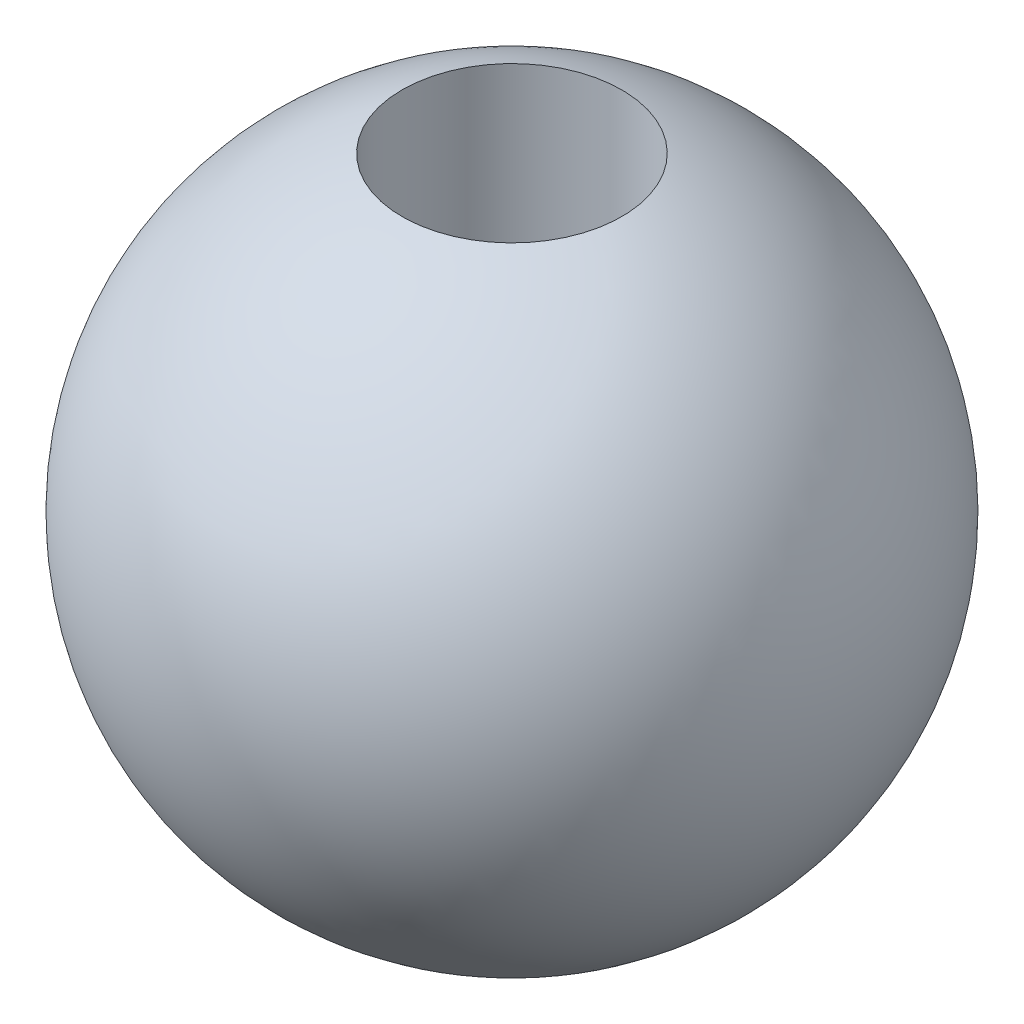
ISO-10303-21;
HEADER;
FILE_DESCRIPTION(('STEP AP214'),'2;1');
FILE_NAME('part.step','',(''),(''),'','','');
FILE_SCHEMA(('AUTOMOTIVE_DESIGN { 1 0 10303 214 1 1 1 1 }'));
ENDSEC;
DATA;
#1=APPLICATION_CONTEXT('core data for automotive mechanical design processes');
#2=APPLICATION_PROTOCOL_DEFINITION('international standard','automotive_design',2000,#1);
#3=PRODUCT_CONTEXT('',#1,'mechanical');
#4=PRODUCT('Part','Part','',(#3));
#5=PRODUCT_RELATED_PRODUCT_CATEGORY('part','',(#4));
#6=PRODUCT_DEFINITION_FORMATION('','',#4);
#7=PRODUCT_DEFINITION_CONTEXT('part definition',#1,'design');
#8=PRODUCT_DEFINITION('design','',#6,#7);
#9=PRODUCT_DEFINITION_SHAPE('','',#8);
#10=(LENGTH_UNIT() NAMED_UNIT(*) SI_UNIT(.MILLI.,.METRE.));
#11=(NAMED_UNIT(*) PLANE_ANGLE_UNIT() SI_UNIT($,.RADIAN.));
#12=(NAMED_UNIT(*) SI_UNIT($,.STERADIAN.) SOLID_ANGLE_UNIT());
#13=UNCERTAINTY_MEASURE_WITH_UNIT(LENGTH_MEASURE(1.E-05),#10,'distance_accuracy_value','');
#14=(GEOMETRIC_REPRESENTATION_CONTEXT(3) GLOBAL_UNCERTAINTY_ASSIGNED_CONTEXT((#13)) GLOBAL_UNIT_ASSIGNED_CONTEXT((#10,
#11,#12)) REPRESENTATION_CONTEXT('',''));
#15=CARTESIAN_POINT('',(0.,0.,0.));
#16=DIRECTION('',(0.,0.,1.));
#17=DIRECTION('',(1.,0.,0.));
#18=AXIS2_PLACEMENT_3D('',#15,#16,#17);
#19=CARTESIAN_POINT('',(0.,3.,0.));
#20=DIRECTION('',(0.,-1.,0.));
#21=DIRECTION('',(-1.,0.,0.));
#22=AXIS2_PLACEMENT_3D('',#19,#20,#21);
#23=SPHERICAL_SURFACE('',#22,3.);
#24=CARTESIAN_POINT('',(0.,0.17157287525381,0.));
#25=DIRECTION('',(0.,1.,0.));
#26=DIRECTION('',(0.,0.,1.));
#27=AXIS2_PLACEMENT_3D('',#24,#25,#26);
#28=CIRCLE('',#27,1.);
#29=CARTESIAN_POINT('',(-1.,0.17157287525381,0.));
#30=VERTEX_POINT('',#29);
#31=EDGE_CURVE('E10',#30,#30,#28,.F.);
#32=CARTESIAN_POINT('',(0.,5.82842712474619,0.));
#33=DIRECTION('',(0.,-1.,0.));
#34=DIRECTION('',(0.,0.,-1.));
#35=AXIS2_PLACEMENT_3D('',#32,#33,#34);
#36=CIRCLE('',#35,1.);
#37=CARTESIAN_POINT('',(-1.,5.82842712474619,0.));
#38=VERTEX_POINT('',#37);
#39=EDGE_CURVE('E39',#38,#38,#36,.F.);
#40=CARTESIAN_POINT('',(-1.,0.17157287525381,0.));
#41=CARTESIAN_POINT('',(-1.07253751170574,0.197212105878642,0.));
#42=CARTESIAN_POINT('',(-1.1440836278635,0.225652914226359,0.));
#43=CARTESIAN_POINT('',(-1.28478097148411,0.287944187878155,0.));
#44=CARTESIAN_POINT('',(-1.35393219894695,0.321794653182234,0.));
#45=CARTESIAN_POINT('',(-1.48942766757876,0.394711742257346,0.));
#46=CARTESIAN_POINT('',(-1.55577190874772,0.433778366028379,0.));
#47=CARTESIAN_POINT('',(-1.68526170991138,0.516894838969989,0.));
#48=CARTESIAN_POINT('',(-1.74840726990608,0.560944688140565,0.));
#49=CARTESIAN_POINT('',(-1.87112592022129,0.653767495482415,0.));
#50=CARTESIAN_POINT('',(-1.9306990105418,0.702540453653688,0.));
#51=CARTESIAN_POINT('',(-2.04592034055685,0.80452080466868,0.));
#52=CARTESIAN_POINT('',(-2.10156858025139,0.857728197512398,0.));
#53=CARTESIAN_POINT('',(-2.20861097471787,0.96826267409257,0.));
#54=CARTESIAN_POINT('',(-2.26000512948981,1.02558975782902,0.));
#55=CARTESIAN_POINT('',(-2.35823530684679,1.14402445583228,0.));
#56=CARTESIAN_POINT('',(-2.40507132943182,1.20513207009907,0.));
#57=CARTESIAN_POINT('',(-2.49390815613454,1.33076631476317,0.));
#58=CARTESIAN_POINT('',(-2.53590896025223,1.39529294516047,0.));
#59=CARTESIAN_POINT('',(-2.61482687063418,1.52738347737439,0.));
#60=CARTESIAN_POINT('',(-2.65174397689843,1.59494737919101,0.));
#61=CARTESIAN_POINT('',(-2.72027608732156,1.7327127416735,0.));
#62=CARTESIAN_POINT('',(-2.75189109148043,1.80291420233937,0.));
#63=CARTESIAN_POINT('',(-2.80963196114713,1.94553936574051,0.));
#64=CARTESIAN_POINT('',(-2.83575782665497,2.01796306847579,0.));
#65=CARTESIAN_POINT('',(-2.88236585657357,2.16460425235809,0.));
#66=CARTESIAN_POINT('',(-2.90284802098433,2.23882173350512,0.));
#67=CARTESIAN_POINT('',(-2.93804747479883,2.38861139841885,0.));
#68=CARTESIAN_POINT('',(-2.95276476420256,2.46418358218556,0.));
#69=CARTESIAN_POINT('',(-2.97634739949325,2.6162355620359,0.));
#70=CARTESIAN_POINT('',(-2.9852127453802,2.69271535811953,0.));
#71=CARTESIAN_POINT('',(-2.99703904563357,2.84613010280211,0.));
#72=CARTESIAN_POINT('',(-3.,2.92306505140106,0.));
#73=CARTESIAN_POINT('',(-3.,3.07693494859894,0.));
#74=CARTESIAN_POINT('',(-2.99703904563357,3.15386989719789,0.));
#75=CARTESIAN_POINT('',(-2.9852127453802,3.30728464188047,0.));
#76=CARTESIAN_POINT('',(-2.97634739949325,3.3837644379641,0.));
#77=CARTESIAN_POINT('',(-2.95276476420256,3.53581641781444,0.));
#78=CARTESIAN_POINT('',(-2.93804747479883,3.61138860158115,0.));
#79=CARTESIAN_POINT('',(-2.90284802098433,3.76117826649488,0.));
#80=CARTESIAN_POINT('',(-2.88236585657357,3.83539574764191,0.));
#81=CARTESIAN_POINT('',(-2.83575782665497,3.98203693152421,0.));
#82=CARTESIAN_POINT('',(-2.80963196114713,4.05446063425949,0.));
#83=CARTESIAN_POINT('',(-2.75189109148043,4.19708579766063,0.));
#84=CARTESIAN_POINT('',(-2.72027608732156,4.2672872583265,0.));
#85=CARTESIAN_POINT('',(-2.65174397689843,4.40505262080899,0.));
#86=CARTESIAN_POINT('',(-2.61482687063418,4.47261652262561,0.));
#87=CARTESIAN_POINT('',(-2.53590896025223,4.60470705483953,0.));
#88=CARTESIAN_POINT('',(-2.49390815613454,4.66923368523683,0.));
#89=CARTESIAN_POINT('',(-2.40507132943182,4.79486792990093,0.));
#90=CARTESIAN_POINT('',(-2.35823530684679,4.85597554416772,0.));
#91=CARTESIAN_POINT('',(-2.26000512948981,4.97441024217098,0.));
#92=CARTESIAN_POINT('',(-2.20861097471787,5.03173732590743,0.));
#93=CARTESIAN_POINT('',(-2.10156858025139,5.1422718024876,0.));
#94=CARTESIAN_POINT('',(-2.04592034055685,5.19547919533132,0.));
#95=CARTESIAN_POINT('',(-1.9306990105418,5.29745954634631,0.));
#96=CARTESIAN_POINT('',(-1.87112592022129,5.34623250451759,0.));
#97=CARTESIAN_POINT('',(-1.74840726990608,5.43905531185944,0.));
#98=CARTESIAN_POINT('',(-1.68526170991138,5.48310516103001,0.));
#99=CARTESIAN_POINT('',(-1.55577190874772,5.56622163397162,0.));
#100=CARTESIAN_POINT('',(-1.48942766757876,5.60528825774265,0.));
#101=CARTESIAN_POINT('',(-1.35393219894695,5.67820534681777,0.));
#102=CARTESIAN_POINT('',(-1.28478097148411,5.71205581212184,0.));
#103=CARTESIAN_POINT('',(-1.1440836278635,5.77434708577364,0.));
#104=CARTESIAN_POINT('',(-1.07253751170574,5.80278789412136,0.));
#105=CARTESIAN_POINT('',(-1.,5.82842712474619,0.));
#106=B_SPLINE_CURVE_WITH_KNOTS('',3,(#40,#41,#42,#43,#44,#45,#46,#47,#48,#49,#50,#51,#52,#53,
#54,#55,#56,#57,#58,#59,#60,#61,#62,#63,#64,#65,#66,#67,#68,#69,#70,#71,#72,#73,#74,#75,#76,#77,
#78,#79,#80,#81,#82,#83,#84,#85,#86,#87,#88,#89,#90,#91,#92,#93,#94,#95,#96,#97,#98,#99,#100,
#101,#102,#103,#104,#105),.UNSPECIFIED.,.F.,.F.,(4,2,2,2,2,2,2,2,2,2,2,2,2,2,2,2,2,2,2,2,2,2,2,
2,2,2,2,2,2,2,2,2,4),(0.,0.230747972816009,0.461495945632017,0.692243918448027,
0.922991891264035,1.15373986408004,1.38448783689605,1.61523580971206,1.84598378252807,
2.07673175534408,2.30747972816009,2.5382277009761,2.76897567379211,2.99972364660811,
3.23047161942412,3.46121959224013,3.69196756505614,3.92271553787215,4.15346351068816,
4.38421148350417,4.61495945632018,4.84570742913618,5.07645540195219,5.3072033747682,
5.53795134758421,5.76869932040022,5.99944729321623,6.23019526603224,6.46094323884824,
6.69169121166425,6.92243918448026,7.15318715729627,7.38393513011228),.UNSPECIFIED.);
#107=EDGE_CURVE('BSEAM33',#30,#38,#106,.T.);
#108=ORIENTED_EDGE('',*,*,#31,.F.);
#109=ORIENTED_EDGE('',*,*,#39,.F.);
#110=ORIENTED_EDGE('',*,*,#107,.T.);
#111=ORIENTED_EDGE('',*,*,#107,.F.);
#112=EDGE_LOOP('',(#108,#110,#109,#111));
#113=FACE_BOUND('',#112,.T.);
#114=ADVANCED_FACE('F33',(#113),#23,.T.);
#115=CARTESIAN_POINT('',(0.,0.,0.));
#116=DIRECTION('',(0.,-1.,0.));
#117=DIRECTION('',(0.,0.,-1.));
#118=AXIS2_PLACEMENT_3D('',#115,#116,#117);
#119=CYLINDRICAL_SURFACE('',#118,1.);
#120=ORIENTED_EDGE('',*,*,#31,.T.);
#121=EDGE_LOOP('',(#120));
#122=FACE_BOUND('',#121,.T.);
#123=ORIENTED_EDGE('',*,*,#39,.T.);
#124=EDGE_LOOP('',(#123));
#125=FACE_BOUND('',#124,.T.);
#126=ADVANCED_FACE('F45',(#122,#125),#119,.F.);
#127=CLOSED_SHELL('',(#114,#126));
#128=MANIFOLD_SOLID_BREP('B2',#127);
#129=ADVANCED_BREP_SHAPE_REPRESENTATION('',(#18,#128),#14);
#130=SHAPE_DEFINITION_REPRESENTATION(#9,#129);
ENDSEC;
END-ISO-10303-21;
